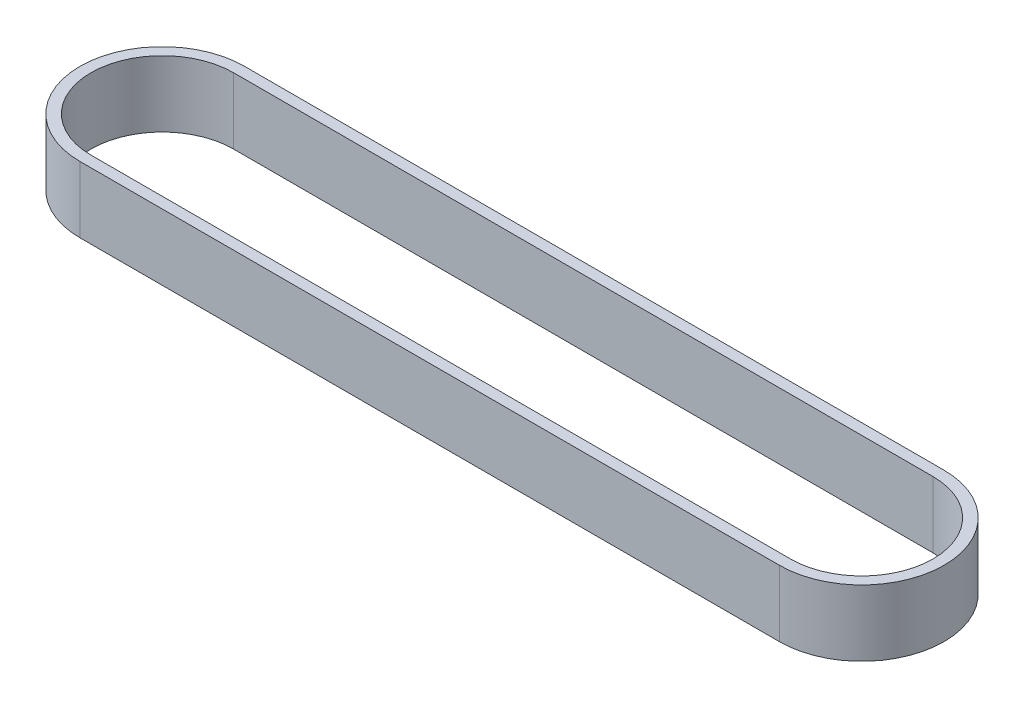
ISO-10303-21;
HEADER;
FILE_DESCRIPTION(('STEP AP214'),'2;1');
FILE_NAME('part.step','',(''),(''),'','','');
FILE_SCHEMA(('AUTOMOTIVE_DESIGN { 1 0 10303 214 1 1 1 1 }'));
ENDSEC;
DATA;
#1=APPLICATION_CONTEXT('core data for automotive mechanical design processes');
#2=APPLICATION_PROTOCOL_DEFINITION('international standard','automotive_design',2000,#1);
#3=PRODUCT_CONTEXT('',#1,'mechanical');
#4=PRODUCT('Part','Part','',(#3));
#5=PRODUCT_RELATED_PRODUCT_CATEGORY('part','',(#4));
#6=PRODUCT_DEFINITION_FORMATION('','',#4);
#7=PRODUCT_DEFINITION_CONTEXT('part definition',#1,'design');
#8=PRODUCT_DEFINITION('design','',#6,#7);
#9=PRODUCT_DEFINITION_SHAPE('','',#8);
#10=(LENGTH_UNIT() NAMED_UNIT(*) SI_UNIT(.MILLI.,.METRE.));
#11=(NAMED_UNIT(*) PLANE_ANGLE_UNIT() SI_UNIT($,.RADIAN.));
#12=(NAMED_UNIT(*) SI_UNIT($,.STERADIAN.) SOLID_ANGLE_UNIT());
#13=UNCERTAINTY_MEASURE_WITH_UNIT(LENGTH_MEASURE(1.E-05),#10,'distance_accuracy_value','');
#14=(GEOMETRIC_REPRESENTATION_CONTEXT(3) GLOBAL_UNCERTAINTY_ASSIGNED_CONTEXT((#13)) GLOBAL_UNIT_ASSIGNED_CONTEXT((#10,
#11,#12)) REPRESENTATION_CONTEXT('',''));
#15=CARTESIAN_POINT('',(0.,0.,0.));
#16=DIRECTION('',(0.,0.,1.));
#17=DIRECTION('',(1.,0.,0.));
#18=AXIS2_PLACEMENT_3D('',#15,#16,#17);
#19=CARTESIAN_POINT('',(-31.73,6.,0.));
#20=DIRECTION('',(0.,1.,0.));
#21=DIRECTION('',(0.,0.,1.));
#22=AXIS2_PLACEMENT_3D('',#19,#20,#21);
#23=PLANE('',#22);
#24=CARTESIAN_POINT('',(-31.73,6.,0.));
#25=DIRECTION('',(0.,1.,0.));
#26=DIRECTION('',(0.,0.,1.));
#27=AXIS2_PLACEMENT_3D('',#24,#25,#26);
#28=CIRCLE('',#27,7.47);
#29=CARTESIAN_POINT('',(-31.73,6.,-7.47));
#30=VERTEX_POINT('',#29);
#31=CARTESIAN_POINT('',(-31.73,6.,7.47));
#32=VERTEX_POINT('',#31);
#33=EDGE_CURVE('E134',#30,#32,#28,.T.);
#34=ORIENTED_EDGE('',*,*,#33,.T.);
#35=DIRECTION('',(1.,0.,0.));
#36=VECTOR('',#35,1.);
#37=CARTESIAN_POINT('',(-31.73,6.,7.47));
#38=LINE('',#37,#36);
#39=CARTESIAN_POINT('',(31.73,6.,7.47));
#40=VERTEX_POINT('',#39);
#41=EDGE_CURVE('E137',#32,#40,#38,.T.);
#42=ORIENTED_EDGE('',*,*,#41,.T.);
#43=CARTESIAN_POINT('',(31.73,6.,0.));
#44=DIRECTION('',(0.,1.,0.));
#45=DIRECTION('',(0.,0.,1.));
#46=AXIS2_PLACEMENT_3D('',#43,#44,#45);
#47=CIRCLE('',#46,7.47);
#48=CARTESIAN_POINT('',(31.73,6.,-7.47));
#49=VERTEX_POINT('',#48);
#50=EDGE_CURVE('E140',#40,#49,#47,.T.);
#51=ORIENTED_EDGE('',*,*,#50,.T.);
#52=DIRECTION('',(-1.,0.,0.));
#53=VECTOR('',#52,1.);
#54=CARTESIAN_POINT('',(-31.73,6.,-7.47));
#55=LINE('',#54,#53);
#56=EDGE_CURVE('E142',#49,#30,#55,.T.);
#57=ORIENTED_EDGE('',*,*,#56,.T.);
#58=EDGE_LOOP('',(#34,#42,#51,#57));
#59=FACE_BOUND('',#58,.T.);
#60=DIRECTION('',(-1.,0.,0.));
#61=VECTOR('',#60,1.);
#62=CARTESIAN_POINT('',(-31.73,6.,-6.47));
#63=LINE('',#62,#61);
#64=CARTESIAN_POINT('',(31.73,6.,-6.47));
#65=VERTEX_POINT('',#64);
#66=CARTESIAN_POINT('',(-31.73,6.,-6.47));
#67=VERTEX_POINT('',#66);
#68=EDGE_CURVE('E106',#65,#67,#63,.T.);
#69=ORIENTED_EDGE('',*,*,#68,.F.);
#70=CARTESIAN_POINT('',(31.73,6.,0.));
#71=DIRECTION('',(0.,1.,0.));
#72=DIRECTION('',(0.,0.,1.));
#73=AXIS2_PLACEMENT_3D('',#70,#71,#72);
#74=CIRCLE('',#73,6.47);
#75=CARTESIAN_POINT('',(31.73,6.,6.47));
#76=VERTEX_POINT('',#75);
#77=EDGE_CURVE('E98',#76,#65,#74,.T.);
#78=ORIENTED_EDGE('',*,*,#77,.F.);
#79=DIRECTION('',(1.,0.,0.));
#80=VECTOR('',#79,1.);
#81=CARTESIAN_POINT('',(-31.73,6.,6.47));
#82=LINE('',#81,#80);
#83=CARTESIAN_POINT('',(-31.73,6.,6.47));
#84=VERTEX_POINT('',#83);
#85=EDGE_CURVE('E120',#84,#76,#82,.T.);
#86=ORIENTED_EDGE('',*,*,#85,.F.);
#87=CARTESIAN_POINT('',(-31.73,6.,0.));
#88=DIRECTION('',(0.,1.,0.));
#89=DIRECTION('',(0.,0.,1.));
#90=AXIS2_PLACEMENT_3D('',#87,#88,#89);
#91=CIRCLE('',#90,6.47);
#92=EDGE_CURVE('E118',#67,#84,#91,.T.);
#93=ORIENTED_EDGE('',*,*,#92,.F.);
#94=EDGE_LOOP('',(#69,#78,#86,#93));
#95=FACE_BOUND('',#94,.T.);
#96=ADVANCED_FACE('F33',(#59,#95),#23,.T.);
#97=CARTESIAN_POINT('',(-31.73,0.,0.));
#98=DIRECTION('',(0.,1.,0.));
#99=DIRECTION('',(0.,0.,1.));
#100=AXIS2_PLACEMENT_3D('',#97,#98,#99);
#101=PLANE('',#100);
#102=CARTESIAN_POINT('',(-31.73,0.,0.));
#103=DIRECTION('',(0.,1.,0.));
#104=DIRECTION('',(0.,0.,1.));
#105=AXIS2_PLACEMENT_3D('',#102,#103,#104);
#106=CIRCLE('',#105,7.47);
#107=CARTESIAN_POINT('',(-31.73,0.,-7.47));
#108=VERTEX_POINT('',#107);
#109=CARTESIAN_POINT('',(-31.73,0.,7.47));
#110=VERTEX_POINT('',#109);
#111=EDGE_CURVE('E114',#108,#110,#106,.T.);
#112=ORIENTED_EDGE('',*,*,#111,.F.);
#113=DIRECTION('',(-1.,0.,0.));
#114=VECTOR('',#113,1.);
#115=CARTESIAN_POINT('',(-31.73,0.,-7.47));
#116=LINE('',#115,#114);
#117=CARTESIAN_POINT('',(31.73,0.,-7.47));
#118=VERTEX_POINT('',#117);
#119=EDGE_CURVE('E138',#118,#108,#116,.T.);
#120=ORIENTED_EDGE('',*,*,#119,.F.);
#121=CARTESIAN_POINT('',(31.73,0.,0.));
#122=DIRECTION('',(0.,1.,0.));
#123=DIRECTION('',(0.,0.,1.));
#124=AXIS2_PLACEMENT_3D('',#121,#122,#123);
#125=CIRCLE('',#124,7.47);
#126=CARTESIAN_POINT('',(31.73,0.,7.47));
#127=VERTEX_POINT('',#126);
#128=EDGE_CURVE('E149',#127,#118,#125,.T.);
#129=ORIENTED_EDGE('',*,*,#128,.F.);
#130=DIRECTION('',(1.,0.,0.));
#131=VECTOR('',#130,1.);
#132=CARTESIAN_POINT('',(-31.73,0.,7.47));
#133=LINE('',#132,#131);
#134=EDGE_CURVE('E147',#110,#127,#133,.T.);
#135=ORIENTED_EDGE('',*,*,#134,.F.);
#136=EDGE_LOOP('',(#112,#120,#129,#135));
#137=FACE_BOUND('',#136,.T.);
#138=CARTESIAN_POINT('',(31.73,0.,0.));
#139=DIRECTION('',(0.,1.,0.));
#140=DIRECTION('',(0.,0.,1.));
#141=AXIS2_PLACEMENT_3D('',#138,#139,#140);
#142=CIRCLE('',#141,6.47);
#143=CARTESIAN_POINT('',(31.73,0.,6.47));
#144=VERTEX_POINT('',#143);
#145=CARTESIAN_POINT('',(31.73,0.,-6.47));
#146=VERTEX_POINT('',#145);
#147=EDGE_CURVE('E56',#144,#146,#142,.T.);
#148=ORIENTED_EDGE('',*,*,#147,.T.);
#149=DIRECTION('',(-1.,0.,0.));
#150=VECTOR('',#149,1.);
#151=CARTESIAN_POINT('',(-31.73,0.,-6.47));
#152=LINE('',#151,#150);
#153=CARTESIAN_POINT('',(-31.73,0.,-6.47));
#154=VERTEX_POINT('',#153);
#155=EDGE_CURVE('E113',#146,#154,#152,.T.);
#156=ORIENTED_EDGE('',*,*,#155,.T.);
#157=CARTESIAN_POINT('',(-31.73,0.,0.));
#158=DIRECTION('',(0.,1.,0.));
#159=DIRECTION('',(0.,0.,1.));
#160=AXIS2_PLACEMENT_3D('',#157,#158,#159);
#161=CIRCLE('',#160,6.47);
#162=CARTESIAN_POINT('',(-31.73,0.,6.47));
#163=VERTEX_POINT('',#162);
#164=EDGE_CURVE('E126',#154,#163,#161,.T.);
#165=ORIENTED_EDGE('',*,*,#164,.T.);
#166=DIRECTION('',(1.,0.,0.));
#167=VECTOR('',#166,1.);
#168=CARTESIAN_POINT('',(-31.73,0.,6.47));
#169=LINE('',#168,#167);
#170=EDGE_CURVE('E107',#163,#144,#169,.T.);
#171=ORIENTED_EDGE('',*,*,#170,.T.);
#172=EDGE_LOOP('',(#148,#156,#165,#171));
#173=FACE_BOUND('',#172,.T.);
#174=ADVANCED_FACE('F167',(#137,#173),#101,.F.);
#175=CARTESIAN_POINT('',(-31.73,6.,0.));
#176=DIRECTION('',(0.,-1.,0.));
#177=DIRECTION('',(0.,0.,-1.));
#178=AXIS2_PLACEMENT_3D('',#175,#176,#177);
#179=CYLINDRICAL_SURFACE('',#178,7.47);
#180=ORIENTED_EDGE('',*,*,#111,.T.);
#181=DIRECTION('',(0.,-1.,0.));
#182=VECTOR('',#181,1.);
#183=CARTESIAN_POINT('',(-31.73,6.,7.47));
#184=LINE('',#183,#182);
#185=EDGE_CURVE('E11',#32,#110,#184,.T.);
#186=ORIENTED_EDGE('',*,*,#185,.F.);
#187=ORIENTED_EDGE('',*,*,#33,.F.);
#188=DIRECTION('',(0.,-1.,0.));
#189=VECTOR('',#188,1.);
#190=CARTESIAN_POINT('',(-31.73,6.,-7.47));
#191=LINE('',#190,#189);
#192=EDGE_CURVE('E144',#30,#108,#191,.T.);
#193=ORIENTED_EDGE('',*,*,#192,.T.);
#194=EDGE_LOOP('',(#180,#186,#187,#193));
#195=FACE_BOUND('',#194,.T.);
#196=ADVANCED_FACE('F35',(#195),#179,.T.);
#197=CARTESIAN_POINT('',(-31.73,6.,7.47));
#198=DIRECTION('',(0.,0.,-1.));
#199=DIRECTION('',(-1.,0.,0.));
#200=AXIS2_PLACEMENT_3D('',#197,#198,#199);
#201=PLANE('',#200);
#202=ORIENTED_EDGE('',*,*,#134,.T.);
#203=DIRECTION('',(0.,-1.,0.));
#204=VECTOR('',#203,1.);
#205=CARTESIAN_POINT('',(31.73,6.,7.47));
#206=LINE('',#205,#204);
#207=EDGE_CURVE('E41',#40,#127,#206,.T.);
#208=ORIENTED_EDGE('',*,*,#207,.F.);
#209=ORIENTED_EDGE('',*,*,#41,.F.);
#210=ORIENTED_EDGE('',*,*,#185,.T.);
#211=EDGE_LOOP('',(#202,#208,#209,#210));
#212=FACE_BOUND('',#211,.T.);
#213=ADVANCED_FACE('F177',(#212),#201,.F.);
#214=CARTESIAN_POINT('',(31.73,6.,0.));
#215=DIRECTION('',(0.,-1.,0.));
#216=DIRECTION('',(0.,0.,-1.));
#217=AXIS2_PLACEMENT_3D('',#214,#215,#216);
#218=CYLINDRICAL_SURFACE('',#217,7.47);
#219=ORIENTED_EDGE('',*,*,#128,.T.);
#220=DIRECTION('',(0.,-1.,0.));
#221=VECTOR('',#220,1.);
#222=CARTESIAN_POINT('',(31.73,6.,-7.47));
#223=LINE('',#222,#221);
#224=EDGE_CURVE('E154',#49,#118,#223,.T.);
#225=ORIENTED_EDGE('',*,*,#224,.F.);
#226=ORIENTED_EDGE('',*,*,#50,.F.);
#227=ORIENTED_EDGE('',*,*,#207,.T.);
#228=EDGE_LOOP('',(#219,#225,#226,#227));
#229=FACE_BOUND('',#228,.T.);
#230=ADVANCED_FACE('F161',(#229),#218,.T.);
#231=CARTESIAN_POINT('',(-31.73,6.,-7.47));
#232=DIRECTION('',(0.,0.,1.));
#233=DIRECTION('',(1.,0.,0.));
#234=AXIS2_PLACEMENT_3D('',#231,#232,#233);
#235=PLANE('',#234);
#236=ORIENTED_EDGE('',*,*,#119,.T.);
#237=ORIENTED_EDGE('',*,*,#192,.F.);
#238=ORIENTED_EDGE('',*,*,#56,.F.);
#239=ORIENTED_EDGE('',*,*,#224,.T.);
#240=EDGE_LOOP('',(#236,#237,#238,#239));
#241=FACE_BOUND('',#240,.T.);
#242=ADVANCED_FACE('F171',(#241),#235,.F.);
#243=CARTESIAN_POINT('',(31.73,6.,0.));
#244=DIRECTION('',(0.,-1.,0.));
#245=DIRECTION('',(0.,0.,-1.));
#246=AXIS2_PLACEMENT_3D('',#243,#244,#245);
#247=CYLINDRICAL_SURFACE('',#246,6.47);
#248=ORIENTED_EDGE('',*,*,#147,.F.);
#249=DIRECTION('',(0.,-1.,0.));
#250=VECTOR('',#249,1.);
#251=CARTESIAN_POINT('',(31.73,6.,6.47));
#252=LINE('',#251,#250);
#253=EDGE_CURVE('E102',#76,#144,#252,.T.);
#254=ORIENTED_EDGE('',*,*,#253,.F.);
#255=ORIENTED_EDGE('',*,*,#77,.T.);
#256=DIRECTION('',(0.,-1.,0.));
#257=VECTOR('',#256,1.);
#258=CARTESIAN_POINT('',(31.73,6.,-6.47));
#259=LINE('',#258,#257);
#260=EDGE_CURVE('E101',#65,#146,#259,.T.);
#261=ORIENTED_EDGE('',*,*,#260,.T.);
#262=EDGE_LOOP('',(#248,#254,#255,#261));
#263=FACE_BOUND('',#262,.T.);
#264=ADVANCED_FACE('F100',(#263),#247,.F.);
#265=CARTESIAN_POINT('',(-31.73,6.,-6.47));
#266=DIRECTION('',(0.,0.,1.));
#267=DIRECTION('',(1.,0.,0.));
#268=AXIS2_PLACEMENT_3D('',#265,#266,#267);
#269=PLANE('',#268);
#270=ORIENTED_EDGE('',*,*,#155,.F.);
#271=ORIENTED_EDGE('',*,*,#260,.F.);
#272=ORIENTED_EDGE('',*,*,#68,.T.);
#273=DIRECTION('',(0.,-1.,0.));
#274=VECTOR('',#273,1.);
#275=CARTESIAN_POINT('',(-31.73,6.,-6.47));
#276=LINE('',#275,#274);
#277=EDGE_CURVE('E115',#67,#154,#276,.T.);
#278=ORIENTED_EDGE('',*,*,#277,.T.);
#279=EDGE_LOOP('',(#270,#271,#272,#278));
#280=FACE_BOUND('',#279,.T.);
#281=ADVANCED_FACE('F110',(#280),#269,.T.);
#282=CARTESIAN_POINT('',(-31.73,6.,0.));
#283=DIRECTION('',(0.,-1.,0.));
#284=DIRECTION('',(0.,0.,-1.));
#285=AXIS2_PLACEMENT_3D('',#282,#283,#284);
#286=CYLINDRICAL_SURFACE('',#285,6.47);
#287=ORIENTED_EDGE('',*,*,#164,.F.);
#288=ORIENTED_EDGE('',*,*,#277,.F.);
#289=ORIENTED_EDGE('',*,*,#92,.T.);
#290=DIRECTION('',(0.,-1.,0.));
#291=VECTOR('',#290,1.);
#292=CARTESIAN_POINT('',(-31.73,6.,6.47));
#293=LINE('',#292,#291);
#294=EDGE_CURVE('E48',#84,#163,#293,.T.);
#295=ORIENTED_EDGE('',*,*,#294,.T.);
#296=EDGE_LOOP('',(#287,#288,#289,#295));
#297=FACE_BOUND('',#296,.T.);
#298=ADVANCED_FACE('F200',(#297),#286,.F.);
#299=CARTESIAN_POINT('',(-31.73,6.,6.47));
#300=DIRECTION('',(0.,0.,-1.));
#301=DIRECTION('',(-1.,0.,0.));
#302=AXIS2_PLACEMENT_3D('',#299,#300,#301);
#303=PLANE('',#302);
#304=ORIENTED_EDGE('',*,*,#170,.F.);
#305=ORIENTED_EDGE('',*,*,#294,.F.);
#306=ORIENTED_EDGE('',*,*,#85,.T.);
#307=ORIENTED_EDGE('',*,*,#253,.T.);
#308=EDGE_LOOP('',(#304,#305,#306,#307));
#309=FACE_BOUND('',#308,.T.);
#310=ADVANCED_FACE('F204',(#309),#303,.T.);
#311=CLOSED_SHELL('',(#96,#174,#196,#213,#230,#242,#264,#281,#298,#310));
#312=MANIFOLD_SOLID_BREP('B2',#311);
#313=ADVANCED_BREP_SHAPE_REPRESENTATION('',(#18,#312),#14);
#314=SHAPE_DEFINITION_REPRESENTATION(#9,#313);
ENDSEC;
END-ISO-10303-21;
